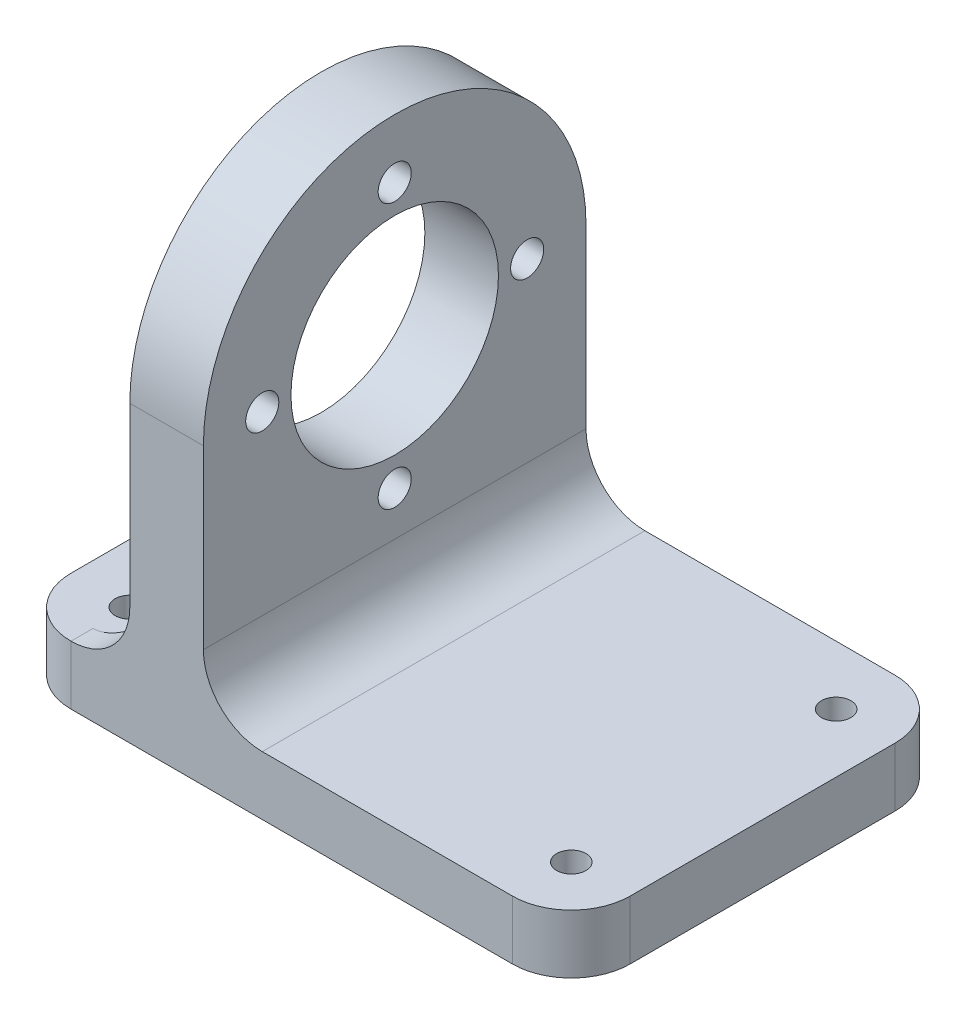
ISO-10303-21;
HEADER;
FILE_DESCRIPTION(('STEP AP214'),'2;1');
FILE_NAME('part.step','',(''),(''),'','','');
FILE_SCHEMA(('AUTOMOTIVE_DESIGN { 1 0 10303 214 1 1 1 1 }'));
ENDSEC;
DATA;
#1=APPLICATION_CONTEXT('core data for automotive mechanical design processes');
#2=APPLICATION_PROTOCOL_DEFINITION('international standard','automotive_design',2000,#1);
#3=PRODUCT_CONTEXT('',#1,'mechanical');
#4=PRODUCT('Part','Part','',(#3));
#5=PRODUCT_RELATED_PRODUCT_CATEGORY('part','',(#4));
#6=PRODUCT_DEFINITION_FORMATION('','',#4);
#7=PRODUCT_DEFINITION_CONTEXT('part definition',#1,'design');
#8=PRODUCT_DEFINITION('design','',#6,#7);
#9=PRODUCT_DEFINITION_SHAPE('','',#8);
#10=(LENGTH_UNIT() NAMED_UNIT(*) SI_UNIT(.MILLI.,.METRE.));
#11=(NAMED_UNIT(*) PLANE_ANGLE_UNIT() SI_UNIT($,.RADIAN.));
#12=(NAMED_UNIT(*) SI_UNIT($,.STERADIAN.) SOLID_ANGLE_UNIT());
#13=UNCERTAINTY_MEASURE_WITH_UNIT(LENGTH_MEASURE(1.E-05),#10,'distance_accuracy_value','');
#14=(GEOMETRIC_REPRESENTATION_CONTEXT(3) GLOBAL_UNCERTAINTY_ASSIGNED_CONTEXT((#13)) GLOBAL_UNIT_ASSIGNED_CONTEXT((#10,
#11,#12)) REPRESENTATION_CONTEXT('',''));
#15=CARTESIAN_POINT('',(0.,0.,0.));
#16=DIRECTION('',(0.,0.,1.));
#17=DIRECTION('',(1.,0.,0.));
#18=AXIS2_PLACEMENT_3D('',#15,#16,#17);
#19=CARTESIAN_POINT('',(-4.,-12.,-13.));
#20=DIRECTION('',(0.,0.,1.));
#21=DIRECTION('',(1.,0.,0.));
#22=AXIS2_PLACEMENT_3D('',#19,#20,#21);
#23=CYLINDRICAL_SURFACE('',#22,4.);
#24=CARTESIAN_POINT('',(-4.,-16.,-11.5));
#25=CARTESIAN_POINT('',(-3.9361734569931,-16.0000131502776,-11.5000119361833));
#26=CARTESIAN_POINT('',(-3.87235581288279,-15.9984726952158,-11.497556087082));
#27=CARTESIAN_POINT('',(-3.74526903397457,-15.9923839092343,-11.487801398607));
#28=CARTESIAN_POINT('',(-3.68199962691591,-15.9878371696499,-11.4805051214404));
#29=CARTESIAN_POINT('',(-3.55683188448498,-15.9758694168761,-11.4612175165463));
#30=CARTESIAN_POINT('',(-3.49492776215978,-15.9684650589789,-11.4492533904921));
#31=CARTESIAN_POINT('',(-3.37256863772368,-15.950968986269,-11.4208015985902));
#32=CARTESIAN_POINT('',(-3.31211376357474,-15.9408770350998,-11.4043135348875));
#33=CARTESIAN_POINT('',(-3.13374077976764,-15.9069394264561,-11.3484180072225));
#34=CARTESIAN_POINT('',(-3.01847966820751,-15.8793982100206,-11.3025263578387));
#35=CARTESIAN_POINT('',(-2.79760177570704,-15.8167371761393,-11.1953064389214));
#36=CARTESIAN_POINT('',(-2.69199702659997,-15.7816080825185,-11.1339592596032));
#37=CARTESIAN_POINT('',(-2.48404897192929,-15.7034004817843,-10.9922223923617));
#38=CARTESIAN_POINT('',(-2.38262678069981,-15.6599126870725,-10.9107091658296));
#39=CARTESIAN_POINT('',(-2.19401230208058,-15.5706198028046,-10.7335466004444));
#40=CARTESIAN_POINT('',(-2.10683724397456,-15.5248119939931,-10.637880408555));
#41=CARTESIAN_POINT('',(-1.93714236494158,-15.4286080433259,-10.4199314628017));
#42=CARTESIAN_POINT('',(-1.85685480981975,-15.3784314812397,-10.2957985974843));
#43=CARTESIAN_POINT('',(-1.71851967498831,-15.2866033240514,-10.032868257523));
#44=CARTESIAN_POINT('',(-1.66043421100966,-15.2449372642527,-9.89409628325965));
#45=CARTESIAN_POINT('',(-1.58133223226703,-15.18619167904,-9.64237966292876));
#46=CARTESIAN_POINT('',(-1.55460930916385,-15.1655383909642,-9.53206781731466));
#47=CARTESIAN_POINT('',(-1.51636327560803,-15.1356272695685,-9.30738965242584));
#48=CARTESIAN_POINT('',(-1.50481889734508,-15.1263534927716,-9.19302923729543));
#49=CARTESIAN_POINT('',(-1.4976216251141,-15.1205977077272,-8.96317366668971));
#50=CARTESIAN_POINT('',(-1.50201034162353,-15.1241491934911,-8.84767632672175));
#51=CARTESIAN_POINT('',(-1.52647377063054,-15.1435481309606,-8.61937920258979));
#52=CARTESIAN_POINT('',(-1.54656097395469,-15.1594053739266,-8.50658164024955));
#53=CARTESIAN_POINT('',(-1.60063776510631,-15.2006513514353,-8.28912366700722));
#54=CARTESIAN_POINT('',(-1.63429921073854,-15.2258140225403,-8.18433621941323));
#55=CARTESIAN_POINT('',(-1.71419581928313,-15.2829110091563,-7.98167863190361));
#56=CARTESIAN_POINT('',(-1.7604355607995,-15.314847789565,-7.88381102724438));
#57=CARTESIAN_POINT('',(-1.8741039355095,-15.3890977162385,-7.67832953618362));
#58=CARTESIAN_POINT('',(-1.94387732388335,-15.4322346899761,-7.5723112315226));
#59=CARTESIAN_POINT('',(-2.09824506398338,-15.5201177779494,-7.37233202460496));
#60=CARTESIAN_POINT('',(-2.18285358093815,-15.5648653973511,-7.27838279633564));
#61=CARTESIAN_POINT('',(-2.3809282201045,-15.6595850194453,-7.08942225498135));
#62=CARTESIAN_POINT('',(-2.49685215813149,-15.7092030056599,-6.99678651554119));
#63=CARTESIAN_POINT('',(-2.74567487958142,-15.8005468472038,-6.83232115158358));
#64=CARTESIAN_POINT('',(-2.87857473092663,-15.842272205613,-6.76049283695121));
#65=CARTESIAN_POINT('',(-3.0842997608176,-15.8943790052449,-6.67262161549608));
#66=CARTESIAN_POINT('',(-3.15196062618732,-15.9097039816921,-6.64710711609092));
#67=CARTESIAN_POINT('',(-3.28982535149926,-15.9370768282918,-6.60189624375363));
#68=CARTESIAN_POINT('',(-3.36002762068787,-15.9491267095831,-6.58219629963374));
#69=CARTESIAN_POINT('',(-3.5021902548837,-15.9695506958203,-6.54897921623228));
#70=CARTESIAN_POINT('',(-3.57414523099331,-15.9779348571125,-6.53544515743575));
#71=CARTESIAN_POINT('',(-3.71926715335585,-15.9907999206439,-6.51473323403823));
#72=CARTESIAN_POINT('',(-3.79243292424371,-15.9952844051941,-6.50754953578481));
#73=CARTESIAN_POINT('',(-3.88815279818234,-15.9984987953494,-6.50240259785252));
#74=CARTESIAN_POINT('',(-3.91052148712157,-15.9990618306498,-6.5015013400556));
#75=CARTESIAN_POINT('',(-3.95525897647898,-15.9998121600068,-6.50030047279548));
#76=CARTESIAN_POINT('',(-3.97762775453766,-15.9999998282321,-6.50000026420145));
#77=CARTESIAN_POINT('',(-4.00000000000001,-16.,-6.5));
#78=B_SPLINE_CURVE_WITH_KNOTS('',3,(#24,#25,#26,#27,#28,#29,#30,#31,#32,#33,#34,#35,#36,#37,#38,
#39,#40,#41,#42,#43,#44,#45,#46,#47,#48,#49,#50,#51,#52,#53,#54,#55,#56,#57,#58,#59,#60,#61,#62,
#63,#64,#65,#66,#67,#68,#69,#70,#71,#72,#73,#74,#75,#76,#77),.UNSPECIFIED.,.F.,.F.,(4,2,2,2,2,2,
2,2,2,2,2,2,2,2,2,2,2,2,2,2,2,2,2,2,2,2,4),(0.,0.191399175832532,0.382697118170854,
0.572896542435409,0.763112699040344,1.14253664794783,1.52242709447158,1.93241222665572,
2.34288954923405,2.80899997842292,3.27431147694233,3.618974902824,3.96315487815413,
4.30823435125186,4.65358867387747,4.99105200609772,5.3286383425281,5.7293005514822,
6.1303474345375,6.59747389227274,7.06462975052635,7.28610034871991,7.507434639536,
7.72815786405858,7.94867811354227,8.01585211889169,8.08295913123195),.UNSPECIFIED.);
#79=CARTESIAN_POINT('',(-4.,-16.,-11.5));
#80=VERTEX_POINT('',#79);
#81=CARTESIAN_POINT('',(-4.,-16.,-6.5));
#82=VERTEX_POINT('',#81);
#83=EDGE_CURVE('E154',#80,#82,#78,.T.);
#84=ORIENTED_EDGE('',*,*,#83,.T.);
#85=DIRECTION('',(0.,0.,-1.));
#86=VECTOR('',#85,1.);
#87=CARTESIAN_POINT('',(-4.,-16.,-13.));
#88=LINE('',#87,#86);
#89=CARTESIAN_POINT('',(-4.,-16.,6.5));
#90=VERTEX_POINT('',#89);
#91=EDGE_CURVE('E163',#90,#82,#88,.T.);
#92=ORIENTED_EDGE('',*,*,#91,.F.);
#93=CARTESIAN_POINT('',(-4.,-16.,6.5));
#94=CARTESIAN_POINT('',(-3.9361734569931,-16.0000131502776,6.49998806381667));
#95=CARTESIAN_POINT('',(-3.87235581288279,-15.9984726952158,6.50244391291799));
#96=CARTESIAN_POINT('',(-3.74526903397457,-15.9923839092343,6.512198601393));
#97=CARTESIAN_POINT('',(-3.68199962691591,-15.9878371696499,6.51949487855961));
#98=CARTESIAN_POINT('',(-3.55683188448498,-15.9758694168761,6.53878248345371));
#99=CARTESIAN_POINT('',(-3.49492776215978,-15.9684650589789,6.5507466095079));
#100=CARTESIAN_POINT('',(-3.37256863772368,-15.950968986269,6.57919840140977));
#101=CARTESIAN_POINT('',(-3.31211376357474,-15.9408770350998,6.59568646511248));
#102=CARTESIAN_POINT('',(-3.13374077976764,-15.9069394264561,6.65158199277754));
#103=CARTESIAN_POINT('',(-3.0184796682075,-15.8793982100206,6.69747364216126));
#104=CARTESIAN_POINT('',(-2.79760177570704,-15.8167371761393,6.80469356107856));
#105=CARTESIAN_POINT('',(-2.69199702659997,-15.7816080825185,6.86604074039681));
#106=CARTESIAN_POINT('',(-2.48404897192929,-15.7034004817843,7.00777760763833));
#107=CARTESIAN_POINT('',(-2.38262678069981,-15.6599126870725,7.08929083417038));
#108=CARTESIAN_POINT('',(-2.19401230208058,-15.5706198028046,7.26645339955558));
#109=CARTESIAN_POINT('',(-2.10683724397456,-15.5248119939931,7.36211959144496));
#110=CARTESIAN_POINT('',(-1.93714236494158,-15.4286080433259,7.58006853719828));
#111=CARTESIAN_POINT('',(-1.85685480981975,-15.3784314812397,7.70420140251568));
#112=CARTESIAN_POINT('',(-1.71851967498831,-15.2866033240514,7.96713174247698));
#113=CARTESIAN_POINT('',(-1.66043421100966,-15.2449372642527,8.10590371674035));
#114=CARTESIAN_POINT('',(-1.58133223226703,-15.18619167904,8.35762033707123));
#115=CARTESIAN_POINT('',(-1.55460930916385,-15.1655383909642,8.46793218268533));
#116=CARTESIAN_POINT('',(-1.51636327560803,-15.1356272695685,8.69261034757415));
#117=CARTESIAN_POINT('',(-1.50481889734508,-15.1263534927716,8.80697076270456));
#118=CARTESIAN_POINT('',(-1.4976216251141,-15.1205977077272,9.03682633331029));
#119=CARTESIAN_POINT('',(-1.50201034162353,-15.1241491934911,9.15232367327825));
#120=CARTESIAN_POINT('',(-1.52647377063054,-15.1435481309606,9.38062079741021));
#121=CARTESIAN_POINT('',(-1.54656097395469,-15.1594053739266,9.49341835975045));
#122=CARTESIAN_POINT('',(-1.60063776510631,-15.2006513514353,9.71087633299277));
#123=CARTESIAN_POINT('',(-1.63429921073853,-15.2258140225403,9.81566378058677));
#124=CARTESIAN_POINT('',(-1.71419581928313,-15.2829110091563,10.0183213680964));
#125=CARTESIAN_POINT('',(-1.7604355607995,-15.314847789565,10.1161889727556));
#126=CARTESIAN_POINT('',(-1.8741039355095,-15.3890977162385,10.3216704638164));
#127=CARTESIAN_POINT('',(-1.94387732388334,-15.4322346899761,10.4276887684774));
#128=CARTESIAN_POINT('',(-2.09824506398338,-15.5201177779494,10.627667975395));
#129=CARTESIAN_POINT('',(-2.18285358093814,-15.5648653973511,10.7216172036644));
#130=CARTESIAN_POINT('',(-2.3809282201045,-15.6595850194453,10.9105777450186));
#131=CARTESIAN_POINT('',(-2.49685215813148,-15.7092030056599,11.0032134844588));
#132=CARTESIAN_POINT('',(-2.74567487958142,-15.8005468472038,11.1676788484164));
#133=CARTESIAN_POINT('',(-2.87857473092663,-15.842272205613,11.2395071630488));
#134=CARTESIAN_POINT('',(-3.08429976081759,-15.8943790052449,11.3273783845039));
#135=CARTESIAN_POINT('',(-3.15196062618731,-15.9097039816921,11.3528928839091));
#136=CARTESIAN_POINT('',(-3.28982535149925,-15.9370768282918,11.3981037562464));
#137=CARTESIAN_POINT('',(-3.36002762068786,-15.9491267095831,11.4178037003663));
#138=CARTESIAN_POINT('',(-3.5021902548837,-15.9695506958203,11.4510207837677));
#139=CARTESIAN_POINT('',(-3.57414523099331,-15.9779348571125,11.4645548425642));
#140=CARTESIAN_POINT('',(-3.71926715335585,-15.9907999206439,11.4852667659618));
#141=CARTESIAN_POINT('',(-3.7924329242437,-15.9952844051941,11.4924504642152));
#142=CARTESIAN_POINT('',(-3.88815279818234,-15.9984987953494,11.4975974021475));
#143=CARTESIAN_POINT('',(-3.91052148712157,-15.9990618306498,11.4984986599444));
#144=CARTESIAN_POINT('',(-3.95525897647898,-15.9998121600068,11.4996995272045));
#145=CARTESIAN_POINT('',(-3.97762775453766,-15.9999998282321,11.4999997357985));
#146=CARTESIAN_POINT('',(-4.00000000000001,-16.,11.5));
#147=B_SPLINE_CURVE_WITH_KNOTS('',3,(#93,#94,#95,#96,#97,#98,#99,#100,#101,#102,#103,#104,#105,
#106,#107,#108,#109,#110,#111,#112,#113,#114,#115,#116,#117,#118,#119,#120,#121,#122,#123,#124,
#125,#126,#127,#128,#129,#130,#131,#132,#133,#134,#135,#136,#137,#138,#139,#140,#141,#142,#143,
#144,#145,#146),.UNSPECIFIED.,.F.,.F.,(4,2,2,2,2,2,2,2,2,2,2,2,2,2,2,2,2,2,2,2,2,2,2,2,2,2,4),
(0.,0.191399175832533,0.382697118170854,0.572896542435409,0.763112699040344,1.14253664794783,
1.52242709447158,1.93241222665572,2.34288954923405,2.80899997842292,3.27431147694233,
3.618974902824,3.96315487815413,4.30823435125186,4.65358867387747,4.99105200609771,
5.3286383425281,5.7293005514822,6.1303474345375,6.59747389227274,7.06462975052635,
7.2861003487199,7.50743463953599,7.72815786405857,7.94867811354227,8.01585211889169,
8.08295913123195),.UNSPECIFIED.);
#148=CARTESIAN_POINT('',(-4.,-16.,11.5));
#149=VERTEX_POINT('',#148);
#150=EDGE_CURVE('E167',#90,#149,#147,.T.);
#151=ORIENTED_EDGE('',*,*,#150,.T.);
#152=CARTESIAN_POINT('',(-4.,-16.,13.));
#153=VERTEX_POINT('',#152);
#154=EDGE_CURVE('E175',#153,#149,#88,.T.);
#155=ORIENTED_EDGE('',*,*,#154,.F.);
#156=CARTESIAN_POINT('',(-4.,-12.,13.));
#157=DIRECTION('',(0.,0.,-1.));
#158=DIRECTION('',(0.,1.,0.));
#159=AXIS2_PLACEMENT_3D('',#156,#157,#158);
#160=CIRCLE('',#159,4.);
#161=CARTESIAN_POINT('',(0.,-12.,13.));
#162=VERTEX_POINT('',#161);
#163=EDGE_CURVE('E196',#162,#153,#160,.T.);
#164=ORIENTED_EDGE('',*,*,#163,.F.);
#165=DIRECTION('',(0.,0.,-1.));
#166=VECTOR('',#165,1.);
#167=CARTESIAN_POINT('',(0.,-12.,13.));
#168=LINE('',#167,#166);
#169=CARTESIAN_POINT('',(0.,-12.,-13.));
#170=VERTEX_POINT('',#169);
#171=EDGE_CURVE('E179',#170,#162,#168,.F.);
#172=ORIENTED_EDGE('',*,*,#171,.F.);
#173=CARTESIAN_POINT('',(-4.,-12.,-13.));
#174=DIRECTION('',(0.,0.,1.));
#175=DIRECTION('',(0.,-1.,0.));
#176=AXIS2_PLACEMENT_3D('',#173,#174,#175);
#177=CIRCLE('',#176,4.);
#178=CARTESIAN_POINT('',(-4.,-16.,-13.));
#179=VERTEX_POINT('',#178);
#180=EDGE_CURVE('E193',#179,#170,#177,.T.);
#181=ORIENTED_EDGE('',*,*,#180,.F.);
#182=EDGE_CURVE('E165',#80,#179,#88,.T.);
#183=ORIENTED_EDGE('',*,*,#182,.F.);
#184=EDGE_LOOP('',(#84,#92,#151,#155,#164,#172,#181,#183));
#185=FACE_BOUND('',#184,.T.);
#186=ADVANCED_FACE('F43',(#185),#23,.F.);
#187=CARTESIAN_POINT('',(-4.,13.,9.));
#188=DIRECTION('',(0.,-1.,0.));
#189=DIRECTION('',(0.,0.,-1.));
#190=AXIS2_PLACEMENT_3D('',#187,#188,#189);
#191=CYLINDRICAL_SURFACE('',#190,1.);
#192=CARTESIAN_POINT('',(-4.,-20.,9.));
#193=DIRECTION('',(0.,1.,0.));
#194=DIRECTION('',(0.,0.,1.));
#195=AXIS2_PLACEMENT_3D('',#192,#193,#194);
#196=CIRCLE('',#195,1.);
#197=CARTESIAN_POINT('',(-4.,-20.,10.));
#198=VERTEX_POINT('',#197);
#199=EDGE_CURVE('E263',#198,#198,#196,.T.);
#200=ORIENTED_EDGE('',*,*,#199,.F.);
#201=EDGE_LOOP('',(#200));
#202=FACE_BOUND('',#201,.T.);
#203=CARTESIAN_POINT('',(-4.,-16.,9.));
#204=DIRECTION('',(0.,1.,0.));
#205=DIRECTION('',(0.,0.,1.));
#206=AXIS2_PLACEMENT_3D('',#203,#204,#205);
#207=CIRCLE('',#206,1.);
#208=CARTESIAN_POINT('',(-4.,-16.,10.));
#209=VERTEX_POINT('',#208);
#210=EDGE_CURVE('E258',#209,#209,#207,.F.);
#211=ORIENTED_EDGE('',*,*,#210,.F.);
#212=EDGE_LOOP('',(#211));
#213=FACE_BOUND('',#212,.T.);
#214=ADVANCED_FACE('F448',(#202,#213),#191,.F.);
#215=CARTESIAN_POINT('',(-4.,13.,-9.));
#216=DIRECTION('',(0.,-1.,0.));
#217=DIRECTION('',(0.,0.,-1.));
#218=AXIS2_PLACEMENT_3D('',#215,#216,#217);
#219=CYLINDRICAL_SURFACE('',#218,1.);
#220=CARTESIAN_POINT('',(-4.,-20.,-9.));
#221=DIRECTION('',(0.,1.,0.));
#222=DIRECTION('',(0.,0.,1.));
#223=AXIS2_PLACEMENT_3D('',#220,#221,#222);
#224=CIRCLE('',#223,1.);
#225=CARTESIAN_POINT('',(-4.,-20.,-8.));
#226=VERTEX_POINT('',#225);
#227=EDGE_CURVE('E504',#226,#226,#224,.T.);
#228=ORIENTED_EDGE('',*,*,#227,.F.);
#229=EDGE_LOOP('',(#228));
#230=FACE_BOUND('',#229,.T.);
#231=CARTESIAN_POINT('',(-4.,-16.,-9.));
#232=DIRECTION('',(0.,1.,0.));
#233=DIRECTION('',(0.,0.,1.));
#234=AXIS2_PLACEMENT_3D('',#231,#232,#233);
#235=CIRCLE('',#234,1.);
#236=CARTESIAN_POINT('',(-4.,-16.,-8.));
#237=VERTEX_POINT('',#236);
#238=EDGE_CURVE('E250',#237,#237,#235,.F.);
#239=ORIENTED_EDGE('',*,*,#238,.F.);
#240=EDGE_LOOP('',(#239));
#241=FACE_BOUND('',#240,.T.);
#242=ADVANCED_FACE('F453',(#230,#241),#219,.F.);
#243=CARTESIAN_POINT('',(5.,0.,0.));
#244=DIRECTION('',(-1.,0.,0.));
#245=DIRECTION('',(0.,0.,1.));
#246=AXIS2_PLACEMENT_3D('',#243,#244,#245);
#247=PLANE('',#246);
#248=DIRECTION('',(0.,-1.,0.));
#249=VECTOR('',#248,1.);
#250=CARTESIAN_POINT('',(5.,0.,13.));
#251=LINE('',#250,#249);
#252=CARTESIAN_POINT('',(5.,0.,13.));
#253=VERTEX_POINT('',#252);
#254=CARTESIAN_POINT('',(5.,-12.,13.));
#255=VERTEX_POINT('',#254);
#256=EDGE_CURVE('E332',#253,#255,#251,.T.);
#257=ORIENTED_EDGE('',*,*,#256,.T.);
#258=DIRECTION('',(0.,0.,-1.));
#259=VECTOR('',#258,1.);
#260=CARTESIAN_POINT('',(5.,-12.,0.));
#261=LINE('',#260,#259);
#262=CARTESIAN_POINT('',(5.,-12.,-13.));
#263=VERTEX_POINT('',#262);
#264=EDGE_CURVE('E364',#255,#263,#261,.T.);
#265=ORIENTED_EDGE('',*,*,#264,.T.);
#266=DIRECTION('',(0.,1.,0.));
#267=VECTOR('',#266,1.);
#268=CARTESIAN_POINT('',(5.,0.,-13.));
#269=LINE('',#268,#267);
#270=CARTESIAN_POINT('',(5.,0.,-13.));
#271=VERTEX_POINT('',#270);
#272=EDGE_CURVE('E337',#263,#271,#269,.T.);
#273=ORIENTED_EDGE('',*,*,#272,.T.);
#274=CARTESIAN_POINT('',(5.,0.,0.));
#275=DIRECTION('',(1.,0.,0.));
#276=DIRECTION('',(0.,0.,1.));
#277=AXIS2_PLACEMENT_3D('',#274,#275,#276);
#278=CIRCLE('',#277,13.);
#279=EDGE_CURVE('E328',#271,#253,#278,.T.);
#280=ORIENTED_EDGE('',*,*,#279,.T.);
#281=EDGE_LOOP('',(#257,#265,#273,#280));
#282=FACE_BOUND('',#281,.T.);
#283=CARTESIAN_POINT('',(5.,9.,0.));
#284=DIRECTION('',(1.,0.,0.));
#285=DIRECTION('',(0.,0.,-1.));
#286=AXIS2_PLACEMENT_3D('',#283,#284,#285);
#287=CIRCLE('',#286,1.125);
#288=CARTESIAN_POINT('',(5.,9.,-1.125));
#289=VERTEX_POINT('',#288);
#290=EDGE_CURVE('E320',#289,#289,#287,.T.);
#291=ORIENTED_EDGE('',*,*,#290,.F.);
#292=EDGE_LOOP('',(#291));
#293=FACE_BOUND('',#292,.T.);
#294=CARTESIAN_POINT('',(5.,0.,-9.));
#295=DIRECTION('',(1.,0.,0.));
#296=DIRECTION('',(0.,0.,-1.));
#297=AXIS2_PLACEMENT_3D('',#294,#295,#296);
#298=CIRCLE('',#297,1.125);
#299=CARTESIAN_POINT('',(5.,0.,-10.125));
#300=VERTEX_POINT('',#299);
#301=EDGE_CURVE('E312',#300,#300,#298,.T.);
#302=ORIENTED_EDGE('',*,*,#301,.F.);
#303=EDGE_LOOP('',(#302));
#304=FACE_BOUND('',#303,.T.);
#305=CARTESIAN_POINT('',(5.,-9.,0.));
#306=DIRECTION('',(1.,0.,0.));
#307=DIRECTION('',(0.,0.,-1.));
#308=AXIS2_PLACEMENT_3D('',#305,#306,#307);
#309=CIRCLE('',#308,1.125);
#310=CARTESIAN_POINT('',(5.,-9.,-1.125));
#311=VERTEX_POINT('',#310);
#312=EDGE_CURVE('E304',#311,#311,#309,.T.);
#313=ORIENTED_EDGE('',*,*,#312,.F.);
#314=EDGE_LOOP('',(#313));
#315=FACE_BOUND('',#314,.T.);
#316=CARTESIAN_POINT('',(5.,0.,9.));
#317=DIRECTION('',(1.,0.,0.));
#318=DIRECTION('',(0.,0.,-1.));
#319=AXIS2_PLACEMENT_3D('',#316,#317,#318);
#320=CIRCLE('',#319,1.125);
#321=CARTESIAN_POINT('',(5.,0.,7.875));
#322=VERTEX_POINT('',#321);
#323=EDGE_CURVE('E296',#322,#322,#320,.T.);
#324=ORIENTED_EDGE('',*,*,#323,.F.);
#325=EDGE_LOOP('',(#324));
#326=FACE_BOUND('',#325,.T.);
#327=CARTESIAN_POINT('',(5.,0.,0.));
#328=DIRECTION('',(1.,0.,0.));
#329=DIRECTION('',(0.,0.,-1.));
#330=AXIS2_PLACEMENT_3D('',#327,#328,#329);
#331=CIRCLE('',#330,7.05);
#332=CARTESIAN_POINT('',(5.,0.,-7.05));
#333=VERTEX_POINT('',#332);
#334=EDGE_CURVE('E288',#333,#333,#331,.T.);
#335=ORIENTED_EDGE('',*,*,#334,.F.);
#336=EDGE_LOOP('',(#335));
#337=FACE_BOUND('',#336,.T.);
#338=ADVANCED_FACE('F383',(#282,#293,#304,#315,#326,#337),#247,.F.);
#339=CARTESIAN_POINT('',(0.,0.,0.));
#340=DIRECTION('',(-1.,0.,0.));
#341=DIRECTION('',(0.,0.,1.));
#342=AXIS2_PLACEMENT_3D('',#339,#340,#341);
#343=PLANE('',#342);
#344=DIRECTION('',(0.,1.,0.));
#345=VECTOR('',#344,1.);
#346=CARTESIAN_POINT('',(0.,0.,-13.));
#347=LINE('',#346,#345);
#348=CARTESIAN_POINT('',(0.,0.,-13.));
#349=VERTEX_POINT('',#348);
#350=EDGE_CURVE('E333',#170,#349,#347,.T.);
#351=ORIENTED_EDGE('',*,*,#350,.F.);
#352=ORIENTED_EDGE('',*,*,#171,.T.);
#353=DIRECTION('',(0.,-1.,0.));
#354=VECTOR('',#353,1.);
#355=CARTESIAN_POINT('',(0.,0.,13.));
#356=LINE('',#355,#354);
#357=CARTESIAN_POINT('',(0.,0.,13.));
#358=VERTEX_POINT('',#357);
#359=EDGE_CURVE('E344',#358,#162,#356,.T.);
#360=ORIENTED_EDGE('',*,*,#359,.F.);
#361=CARTESIAN_POINT('',(0.,0.,0.));
#362=DIRECTION('',(1.,0.,0.));
#363=DIRECTION('',(0.,0.,1.));
#364=AXIS2_PLACEMENT_3D('',#361,#362,#363);
#365=CIRCLE('',#364,13.);
#366=EDGE_CURVE('E324',#349,#358,#365,.T.);
#367=ORIENTED_EDGE('',*,*,#366,.F.);
#368=EDGE_LOOP('',(#351,#352,#360,#367));
#369=FACE_BOUND('',#368,.T.);
#370=CARTESIAN_POINT('',(0.,0.,9.));
#371=DIRECTION('',(1.,0.,0.));
#372=DIRECTION('',(0.,0.,-1.));
#373=AXIS2_PLACEMENT_3D('',#370,#371,#372);
#374=CIRCLE('',#373,1.125);
#375=CARTESIAN_POINT('',(0.,0.,7.875));
#376=VERTEX_POINT('',#375);
#377=EDGE_CURVE('E292',#376,#376,#374,.T.);
#378=ORIENTED_EDGE('',*,*,#377,.T.);
#379=EDGE_LOOP('',(#378));
#380=FACE_BOUND('',#379,.T.);
#381=CARTESIAN_POINT('',(0.,0.,-9.));
#382=DIRECTION('',(1.,0.,0.));
#383=DIRECTION('',(0.,0.,-1.));
#384=AXIS2_PLACEMENT_3D('',#381,#382,#383);
#385=CIRCLE('',#384,1.125);
#386=CARTESIAN_POINT('',(0.,0.,-10.125));
#387=VERTEX_POINT('',#386);
#388=EDGE_CURVE('E308',#387,#387,#385,.T.);
#389=ORIENTED_EDGE('',*,*,#388,.T.);
#390=EDGE_LOOP('',(#389));
#391=FACE_BOUND('',#390,.T.);
#392=CARTESIAN_POINT('',(0.,9.,0.));
#393=DIRECTION('',(1.,0.,0.));
#394=DIRECTION('',(0.,0.,-1.));
#395=AXIS2_PLACEMENT_3D('',#392,#393,#394);
#396=CIRCLE('',#395,1.125);
#397=CARTESIAN_POINT('',(0.,9.,-1.125));
#398=VERTEX_POINT('',#397);
#399=EDGE_CURVE('E316',#398,#398,#396,.T.);
#400=ORIENTED_EDGE('',*,*,#399,.T.);
#401=EDGE_LOOP('',(#400));
#402=FACE_BOUND('',#401,.T.);
#403=CARTESIAN_POINT('',(0.,-9.,0.));
#404=DIRECTION('',(1.,0.,0.));
#405=DIRECTION('',(0.,0.,-1.));
#406=AXIS2_PLACEMENT_3D('',#403,#404,#405);
#407=CIRCLE('',#406,1.125);
#408=CARTESIAN_POINT('',(0.,-9.,-1.125));
#409=VERTEX_POINT('',#408);
#410=EDGE_CURVE('E300',#409,#409,#407,.T.);
#411=ORIENTED_EDGE('',*,*,#410,.T.);
#412=EDGE_LOOP('',(#411));
#413=FACE_BOUND('',#412,.T.);
#414=CARTESIAN_POINT('',(0.,0.,0.));
#415=DIRECTION('',(1.,0.,0.));
#416=DIRECTION('',(0.,0.,-1.));
#417=AXIS2_PLACEMENT_3D('',#414,#415,#416);
#418=CIRCLE('',#417,7.05);
#419=CARTESIAN_POINT('',(0.,0.,-7.05));
#420=VERTEX_POINT('',#419);
#421=EDGE_CURVE('E285',#420,#420,#418,.T.);
#422=ORIENTED_EDGE('',*,*,#421,.T.);
#423=EDGE_LOOP('',(#422));
#424=FACE_BOUND('',#423,.T.);
#425=ADVANCED_FACE('F417',(#369,#380,#391,#402,#413,#424),#343,.T.);
#426=CARTESIAN_POINT('',(5.,0.,0.));
#427=DIRECTION('',(-1.,0.,0.));
#428=DIRECTION('',(0.,0.,1.));
#429=AXIS2_PLACEMENT_3D('',#426,#427,#428);
#430=CYLINDRICAL_SURFACE('',#429,13.);
#431=ORIENTED_EDGE('',*,*,#366,.T.);
#432=DIRECTION('',(-1.,0.,0.));
#433=VECTOR('',#432,1.);
#434=CARTESIAN_POINT('',(5.,0.,13.));
#435=LINE('',#434,#433);
#436=EDGE_CURVE('E361',#253,#358,#435,.T.);
#437=ORIENTED_EDGE('',*,*,#436,.F.);
#438=ORIENTED_EDGE('',*,*,#279,.F.);
#439=DIRECTION('',(-1.,0.,0.));
#440=VECTOR('',#439,1.);
#441=CARTESIAN_POINT('',(5.,0.,-13.));
#442=LINE('',#441,#440);
#443=EDGE_CURVE('E340',#271,#349,#442,.T.);
#444=ORIENTED_EDGE('',*,*,#443,.T.);
#445=EDGE_LOOP('',(#431,#437,#438,#444));
#446=FACE_BOUND('',#445,.T.);
#447=ADVANCED_FACE('F389',(#446),#430,.T.);
#448=CARTESIAN_POINT('',(5.,0.,13.));
#449=DIRECTION('',(0.,0.,-1.));
#450=DIRECTION('',(0.,1.,0.));
#451=AXIS2_PLACEMENT_3D('',#448,#449,#450);
#452=PLANE('',#451);
#453=DIRECTION('',(-1.,0.,0.));
#454=VECTOR('',#453,1.);
#455=CARTESIAN_POINT('',(5.,-20.,13.));
#456=LINE('',#455,#454);
#457=CARTESIAN_POINT('',(26.,-20.,13.));
#458=VERTEX_POINT('',#457);
#459=CARTESIAN_POINT('',(-4.,-20.,13.));
#460=VERTEX_POINT('',#459);
#461=EDGE_CURVE('E357',#458,#460,#456,.T.);
#462=ORIENTED_EDGE('',*,*,#461,.F.);
#463=DIRECTION('',(0.,1.,0.));
#464=VECTOR('',#463,1.);
#465=CARTESIAN_POINT('',(26.,-16.,13.));
#466=LINE('',#465,#464);
#467=CARTESIAN_POINT('',(26.,-16.,13.));
#468=VERTEX_POINT('',#467);
#469=EDGE_CURVE('E235',#458,#468,#466,.T.);
#470=ORIENTED_EDGE('',*,*,#469,.T.);
#471=DIRECTION('',(-1.,0.,0.));
#472=VECTOR('',#471,1.);
#473=CARTESIAN_POINT('',(30.,-16.,13.));
#474=LINE('',#473,#472);
#475=CARTESIAN_POINT('',(9.,-16.,13.));
#476=VERTEX_POINT('',#475);
#477=EDGE_CURVE('E281',#468,#476,#474,.T.);
#478=ORIENTED_EDGE('',*,*,#477,.T.);
#479=CARTESIAN_POINT('',(9.,-12.,13.));
#480=DIRECTION('',(0.,0.,-1.));
#481=DIRECTION('',(0.,1.,0.));
#482=AXIS2_PLACEMENT_3D('',#479,#480,#481);
#483=CIRCLE('',#482,4.);
#484=EDGE_CURVE('E190',#476,#255,#483,.T.);
#485=ORIENTED_EDGE('',*,*,#484,.T.);
#486=ORIENTED_EDGE('',*,*,#256,.F.);
#487=ORIENTED_EDGE('',*,*,#436,.T.);
#488=ORIENTED_EDGE('',*,*,#359,.T.);
#489=ORIENTED_EDGE('',*,*,#163,.T.);
#490=DIRECTION('',(0.,1.,0.));
#491=VECTOR('',#490,1.);
#492=CARTESIAN_POINT('',(-4.,0.,13.));
#493=LINE('',#492,#491);
#494=EDGE_CURVE('E232',#153,#460,#493,.F.);
#495=ORIENTED_EDGE('',*,*,#494,.T.);
#496=EDGE_LOOP('',(#462,#470,#478,#485,#486,#487,#488,#489,#495));
#497=FACE_BOUND('',#496,.T.);
#498=ADVANCED_FACE('F382',(#497),#452,.F.);
#499=CARTESIAN_POINT('',(5.,-20.,13.));
#500=DIRECTION('',(0.,1.,0.));
#501=DIRECTION('',(0.,0.,1.));
#502=AXIS2_PLACEMENT_3D('',#499,#500,#501);
#503=PLANE('',#502);
#504=CARTESIAN_POINT('',(26.,-20.,9.));
#505=DIRECTION('',(0.,1.,0.));
#506=DIRECTION('',(0.,0.,1.));
#507=AXIS2_PLACEMENT_3D('',#504,#505,#506);
#508=CIRCLE('',#507,1.);
#509=CARTESIAN_POINT('',(26.,-20.,10.));
#510=VERTEX_POINT('',#509);
#511=EDGE_CURVE('E158',#510,#510,#508,.T.);
#512=ORIENTED_EDGE('',*,*,#511,.T.);
#513=EDGE_LOOP('',(#512));
#514=FACE_BOUND('',#513,.T.);
#515=CARTESIAN_POINT('',(26.,-20.,-9.));
#516=DIRECTION('',(0.,1.,0.));
#517=DIRECTION('',(0.,0.,1.));
#518=AXIS2_PLACEMENT_3D('',#515,#516,#517);
#519=CIRCLE('',#518,1.);
#520=CARTESIAN_POINT('',(26.,-20.,-8.));
#521=VERTEX_POINT('',#520);
#522=EDGE_CURVE('E500',#521,#521,#519,.T.);
#523=ORIENTED_EDGE('',*,*,#522,.T.);
#524=EDGE_LOOP('',(#523));
#525=FACE_BOUND('',#524,.T.);
#526=ORIENTED_EDGE('',*,*,#227,.T.);
#527=EDGE_LOOP('',(#526));
#528=FACE_BOUND('',#527,.T.);
#529=ORIENTED_EDGE('',*,*,#199,.T.);
#530=EDGE_LOOP('',(#529));
#531=FACE_BOUND('',#530,.T.);
#532=DIRECTION('',(-1.,0.,0.));
#533=VECTOR('',#532,1.);
#534=CARTESIAN_POINT('',(5.,-20.,-13.));
#535=LINE('',#534,#533);
#536=CARTESIAN_POINT('',(26.,-20.,-13.));
#537=VERTEX_POINT('',#536);
#538=CARTESIAN_POINT('',(-4.,-20.,-13.));
#539=VERTEX_POINT('',#538);
#540=EDGE_CURVE('E353',#537,#539,#535,.T.);
#541=ORIENTED_EDGE('',*,*,#540,.F.);
#542=CARTESIAN_POINT('',(26.,-20.,-9.));
#543=DIRECTION('',(0.,1.,0.));
#544=DIRECTION('',(0.,0.,1.));
#545=AXIS2_PLACEMENT_3D('',#542,#543,#544);
#546=CIRCLE('',#545,4.);
#547=CARTESIAN_POINT('',(30.,-20.,-9.));
#548=VERTEX_POINT('',#547);
#549=EDGE_CURVE('E217',#537,#548,#546,.F.);
#550=ORIENTED_EDGE('',*,*,#549,.T.);
#551=DIRECTION('',(0.,0.,1.));
#552=VECTOR('',#551,1.);
#553=CARTESIAN_POINT('',(30.,-20.,-13.));
#554=LINE('',#553,#552);
#555=CARTESIAN_POINT('',(30.,-20.,9.));
#556=VERTEX_POINT('',#555);
#557=EDGE_CURVE('E273',#548,#556,#554,.T.);
#558=ORIENTED_EDGE('',*,*,#557,.T.);
#559=CARTESIAN_POINT('',(26.,-20.,9.));
#560=DIRECTION('',(0.,1.,0.));
#561=DIRECTION('',(0.,0.,1.));
#562=AXIS2_PLACEMENT_3D('',#559,#560,#561);
#563=CIRCLE('',#562,4.);
#564=EDGE_CURVE('E214',#556,#458,#563,.F.);
#565=ORIENTED_EDGE('',*,*,#564,.T.);
#566=ORIENTED_EDGE('',*,*,#461,.T.);
#567=CARTESIAN_POINT('',(-4.,-20.,9.));
#568=DIRECTION('',(0.,1.,0.));
#569=DIRECTION('',(0.,0.,1.));
#570=AXIS2_PLACEMENT_3D('',#567,#568,#569);
#571=CIRCLE('',#570,4.);
#572=CARTESIAN_POINT('',(-8.,-20.,9.));
#573=VERTEX_POINT('',#572);
#574=EDGE_CURVE('E208',#460,#573,#571,.F.);
#575=ORIENTED_EDGE('',*,*,#574,.T.);
#576=DIRECTION('',(0.,0.,1.));
#577=VECTOR('',#576,1.);
#578=CARTESIAN_POINT('',(-8.,-20.,-13.));
#579=LINE('',#578,#577);
#580=CARTESIAN_POINT('',(-8.,-20.,-9.));
#581=VERTEX_POINT('',#580);
#582=EDGE_CURVE('E256',#581,#573,#579,.T.);
#583=ORIENTED_EDGE('',*,*,#582,.F.);
#584=CARTESIAN_POINT('',(-4.,-20.,-9.));
#585=DIRECTION('',(0.,1.,0.));
#586=DIRECTION('',(0.,0.,1.));
#587=AXIS2_PLACEMENT_3D('',#584,#585,#586);
#588=CIRCLE('',#587,4.);
#589=EDGE_CURVE('E211',#581,#539,#588,.F.);
#590=ORIENTED_EDGE('',*,*,#589,.T.);
#591=EDGE_LOOP('',(#541,#550,#558,#565,#566,#575,#583,#590));
#592=FACE_BOUND('',#591,.T.);
#593=ADVANCED_FACE('F399',(#514,#525,#528,#531,#592),#503,.F.);
#594=CARTESIAN_POINT('',(5.,0.,-13.));
#595=DIRECTION('',(0.,0.,1.));
#596=DIRECTION('',(0.,-1.,0.));
#597=AXIS2_PLACEMENT_3D('',#594,#595,#596);
#598=PLANE('',#597);
#599=DIRECTION('',(-1.,0.,0.));
#600=VECTOR('',#599,1.);
#601=CARTESIAN_POINT('',(30.,-16.,-13.));
#602=LINE('',#601,#600);
#603=CARTESIAN_POINT('',(26.,-16.,-13.));
#604=VERTEX_POINT('',#603);
#605=CARTESIAN_POINT('',(9.,-16.,-13.));
#606=VERTEX_POINT('',#605);
#607=EDGE_CURVE('E282',#604,#606,#602,.T.);
#608=ORIENTED_EDGE('',*,*,#607,.F.);
#609=DIRECTION('',(0.,-1.,0.));
#610=VECTOR('',#609,1.);
#611=CARTESIAN_POINT('',(26.,-20.,-13.));
#612=LINE('',#611,#610);
#613=EDGE_CURVE('E204',#604,#537,#612,.T.);
#614=ORIENTED_EDGE('',*,*,#613,.T.);
#615=ORIENTED_EDGE('',*,*,#540,.T.);
#616=DIRECTION('',(0.,-1.,0.));
#617=VECTOR('',#616,1.);
#618=CARTESIAN_POINT('',(-4.,0.,-13.));
#619=LINE('',#618,#617);
#620=EDGE_CURVE('E200',#539,#179,#619,.F.);
#621=ORIENTED_EDGE('',*,*,#620,.T.);
#622=ORIENTED_EDGE('',*,*,#180,.T.);
#623=ORIENTED_EDGE('',*,*,#350,.T.);
#624=ORIENTED_EDGE('',*,*,#443,.F.);
#625=ORIENTED_EDGE('',*,*,#272,.F.);
#626=CARTESIAN_POINT('',(9.,-12.,-13.));
#627=DIRECTION('',(0.,0.,1.));
#628=DIRECTION('',(0.,-1.,0.));
#629=AXIS2_PLACEMENT_3D('',#626,#627,#628);
#630=CIRCLE('',#629,4.);
#631=EDGE_CURVE('E186',#263,#606,#630,.T.);
#632=ORIENTED_EDGE('',*,*,#631,.T.);
#633=EDGE_LOOP('',(#608,#614,#615,#621,#622,#623,#624,#625,#632));
#634=FACE_BOUND('',#633,.T.);
#635=ADVANCED_FACE('F415',(#634),#598,.F.);
#636=CARTESIAN_POINT('',(5.,9.,0.));
#637=DIRECTION('',(-1.,0.,0.));
#638=DIRECTION('',(0.,0.,1.));
#639=AXIS2_PLACEMENT_3D('',#636,#637,#638);
#640=CYLINDRICAL_SURFACE('',#639,1.125);
#641=ORIENTED_EDGE('',*,*,#290,.T.);
#642=EDGE_LOOP('',(#641));
#643=FACE_BOUND('',#642,.T.);
#644=ORIENTED_EDGE('',*,*,#399,.F.);
#645=EDGE_LOOP('',(#644));
#646=FACE_BOUND('',#645,.T.);
#647=ADVANCED_FACE('F664',(#643,#646),#640,.F.);
#648=CARTESIAN_POINT('',(5.,0.,-9.));
#649=DIRECTION('',(-1.,0.,0.));
#650=DIRECTION('',(0.,0.,1.));
#651=AXIS2_PLACEMENT_3D('',#648,#649,#650);
#652=CYLINDRICAL_SURFACE('',#651,1.125);
#653=ORIENTED_EDGE('',*,*,#301,.T.);
#654=EDGE_LOOP('',(#653));
#655=FACE_BOUND('',#654,.T.);
#656=ORIENTED_EDGE('',*,*,#388,.F.);
#657=EDGE_LOOP('',(#656));
#658=FACE_BOUND('',#657,.T.);
#659=ADVANCED_FACE('F670',(#655,#658),#652,.F.);
#660=CARTESIAN_POINT('',(5.,-9.,0.));
#661=DIRECTION('',(-1.,0.,0.));
#662=DIRECTION('',(0.,0.,1.));
#663=AXIS2_PLACEMENT_3D('',#660,#661,#662);
#664=CYLINDRICAL_SURFACE('',#663,1.125);
#665=ORIENTED_EDGE('',*,*,#312,.T.);
#666=EDGE_LOOP('',(#665));
#667=FACE_BOUND('',#666,.T.);
#668=ORIENTED_EDGE('',*,*,#410,.F.);
#669=EDGE_LOOP('',(#668));
#670=FACE_BOUND('',#669,.T.);
#671=ADVANCED_FACE('F443',(#667,#670),#664,.F.);
#672=CARTESIAN_POINT('',(5.,0.,9.));
#673=DIRECTION('',(-1.,0.,0.));
#674=DIRECTION('',(0.,0.,1.));
#675=AXIS2_PLACEMENT_3D('',#672,#673,#674);
#676=CYLINDRICAL_SURFACE('',#675,1.125);
#677=ORIENTED_EDGE('',*,*,#323,.T.);
#678=EDGE_LOOP('',(#677));
#679=FACE_BOUND('',#678,.T.);
#680=ORIENTED_EDGE('',*,*,#377,.F.);
#681=EDGE_LOOP('',(#680));
#682=FACE_BOUND('',#681,.T.);
#683=ADVANCED_FACE('F434',(#679,#682),#676,.F.);
#684=CARTESIAN_POINT('',(5.,0.,0.));
#685=DIRECTION('',(-1.,0.,0.));
#686=DIRECTION('',(0.,0.,1.));
#687=AXIS2_PLACEMENT_3D('',#684,#685,#686);
#688=CYLINDRICAL_SURFACE('',#687,7.05);
#689=ORIENTED_EDGE('',*,*,#334,.T.);
#690=EDGE_LOOP('',(#689));
#691=FACE_BOUND('',#690,.T.);
#692=ORIENTED_EDGE('',*,*,#421,.F.);
#693=EDGE_LOOP('',(#692));
#694=FACE_BOUND('',#693,.T.);
#695=ADVANCED_FACE('F431',(#691,#694),#688,.F.);
#696=CARTESIAN_POINT('',(-8.,0.,0.));
#697=DIRECTION('',(1.,0.,0.));
#698=DIRECTION('',(0.,0.,-1.));
#699=AXIS2_PLACEMENT_3D('',#696,#697,#698);
#700=PLANE('',#699);
#701=DIRECTION('',(0.,0.,-1.));
#702=VECTOR('',#701,1.);
#703=CARTESIAN_POINT('',(-8.,-16.,-13.));
#704=LINE('',#703,#702);
#705=CARTESIAN_POINT('',(-8.,-16.,9.));
#706=VERTEX_POINT('',#705);
#707=CARTESIAN_POINT('',(-8.,-16.,-9.));
#708=VERTEX_POINT('',#707);
#709=EDGE_CURVE('E270',#706,#708,#704,.T.);
#710=ORIENTED_EDGE('',*,*,#709,.T.);
#711=DIRECTION('',(0.,-1.,0.));
#712=VECTOR('',#711,1.);
#713=CARTESIAN_POINT('',(-8.,0.,-9.));
#714=LINE('',#713,#712);
#715=EDGE_CURVE('E242',#708,#581,#714,.T.);
#716=ORIENTED_EDGE('',*,*,#715,.T.);
#717=ORIENTED_EDGE('',*,*,#582,.T.);
#718=DIRECTION('',(0.,1.,0.));
#719=VECTOR('',#718,1.);
#720=CARTESIAN_POINT('',(-8.,0.,9.));
#721=LINE('',#720,#719);
#722=EDGE_CURVE('E239',#573,#706,#721,.T.);
#723=ORIENTED_EDGE('',*,*,#722,.T.);
#724=EDGE_LOOP('',(#710,#716,#717,#723));
#725=FACE_BOUND('',#724,.T.);
#726=ADVANCED_FACE('F433',(#725),#700,.F.);
#727=CARTESIAN_POINT('',(30.,-16.,-13.));
#728=DIRECTION('',(0.,1.,0.));
#729=DIRECTION('',(0.,0.,1.));
#730=AXIS2_PLACEMENT_3D('',#727,#728,#729);
#731=PLANE('',#730);
#732=CARTESIAN_POINT('',(-4.,-16.,-9.));
#733=DIRECTION('',(0.,1.,0.));
#734=DIRECTION('',(0.,0.,1.));
#735=AXIS2_PLACEMENT_3D('',#732,#733,#734);
#736=CIRCLE('',#735,2.5);
#737=EDGE_CURVE('E151',#82,#80,#736,.T.);
#738=ORIENTED_EDGE('',*,*,#737,.T.);
#739=ORIENTED_EDGE('',*,*,#182,.T.);
#740=CARTESIAN_POINT('',(-4.,-16.,-9.));
#741=DIRECTION('',(0.,1.,0.));
#742=DIRECTION('',(0.,0.,1.));
#743=AXIS2_PLACEMENT_3D('',#740,#741,#742);
#744=CIRCLE('',#743,4.);
#745=EDGE_CURVE('E11',#179,#708,#744,.T.);
#746=ORIENTED_EDGE('',*,*,#745,.T.);
#747=ORIENTED_EDGE('',*,*,#709,.F.);
#748=CARTESIAN_POINT('',(-4.,-16.,9.));
#749=DIRECTION('',(0.,1.,0.));
#750=DIRECTION('',(0.,0.,1.));
#751=AXIS2_PLACEMENT_3D('',#748,#749,#750);
#752=CIRCLE('',#751,4.);
#753=EDGE_CURVE('E53',#706,#153,#752,.T.);
#754=ORIENTED_EDGE('',*,*,#753,.T.);
#755=ORIENTED_EDGE('',*,*,#154,.T.);
#756=CARTESIAN_POINT('',(-4.,-16.,9.));
#757=DIRECTION('',(0.,1.,0.));
#758=DIRECTION('',(0.,0.,1.));
#759=AXIS2_PLACEMENT_3D('',#756,#757,#758);
#760=CIRCLE('',#759,2.5);
#761=EDGE_CURVE('E172',#149,#90,#760,.T.);
#762=ORIENTED_EDGE('',*,*,#761,.T.);
#763=ORIENTED_EDGE('',*,*,#91,.T.);
#764=EDGE_LOOP('',(#738,#739,#746,#747,#754,#755,#762,#763));
#765=FACE_BOUND('',#764,.T.);
#766=ORIENTED_EDGE('',*,*,#238,.T.);
#767=EDGE_LOOP('',(#766));
#768=FACE_BOUND('',#767,.T.);
#769=ORIENTED_EDGE('',*,*,#210,.T.);
#770=EDGE_LOOP('',(#769));
#771=FACE_BOUND('',#770,.T.);
#772=ADVANCED_FACE('F169',(#765,#768,#771),#731,.T.);
#773=CARTESIAN_POINT('',(26.,-16.,9.));
#774=DIRECTION('',(0.,1.,0.));
#775=DIRECTION('',(0.,0.,1.));
#776=AXIS2_PLACEMENT_3D('',#773,#774,#775);
#777=CIRCLE('',#776,1.);
#778=CARTESIAN_POINT('',(26.,-16.,10.));
#779=VERTEX_POINT('',#778);
#780=EDGE_CURVE('E47',#779,#779,#777,.F.);
#781=ORIENTED_EDGE('',*,*,#780,.T.);
#782=EDGE_LOOP('',(#781));
#783=FACE_BOUND('',#782,.T.);
#784=CARTESIAN_POINT('',(26.,-16.,-9.));
#785=DIRECTION('',(0.,1.,0.));
#786=DIRECTION('',(0.,0.,1.));
#787=AXIS2_PLACEMENT_3D('',#784,#785,#786);
#788=CIRCLE('',#787,1.);
#789=CARTESIAN_POINT('',(26.,-16.,-8.));
#790=VERTEX_POINT('',#789);
#791=EDGE_CURVE('E247',#790,#790,#788,.F.);
#792=ORIENTED_EDGE('',*,*,#791,.T.);
#793=EDGE_LOOP('',(#792));
#794=FACE_BOUND('',#793,.T.);
#795=DIRECTION('',(0.,0.,-1.));
#796=VECTOR('',#795,1.);
#797=CARTESIAN_POINT('',(30.,-16.,-13.));
#798=LINE('',#797,#796);
#799=CARTESIAN_POINT('',(30.,-16.,9.));
#800=VERTEX_POINT('',#799);
#801=CARTESIAN_POINT('',(30.,-16.,-9.));
#802=VERTEX_POINT('',#801);
#803=EDGE_CURVE('E277',#800,#802,#798,.T.);
#804=ORIENTED_EDGE('',*,*,#803,.T.);
#805=CARTESIAN_POINT('',(26.,-16.,-9.));
#806=DIRECTION('',(0.,1.,0.));
#807=DIRECTION('',(0.,0.,1.));
#808=AXIS2_PLACEMENT_3D('',#805,#806,#807);
#809=CIRCLE('',#808,4.);
#810=EDGE_CURVE('E229',#802,#604,#809,.T.);
#811=ORIENTED_EDGE('',*,*,#810,.T.);
#812=ORIENTED_EDGE('',*,*,#607,.T.);
#813=DIRECTION('',(0.,0.,-1.));
#814=VECTOR('',#813,1.);
#815=CARTESIAN_POINT('',(9.,-16.,-13.));
#816=LINE('',#815,#814);
#817=EDGE_CURVE('E180',#606,#476,#816,.F.);
#818=ORIENTED_EDGE('',*,*,#817,.T.);
#819=ORIENTED_EDGE('',*,*,#477,.F.);
#820=CARTESIAN_POINT('',(26.,-16.,9.));
#821=DIRECTION('',(0.,1.,0.));
#822=DIRECTION('',(0.,0.,1.));
#823=AXIS2_PLACEMENT_3D('',#820,#821,#822);
#824=CIRCLE('',#823,4.);
#825=EDGE_CURVE('E226',#468,#800,#824,.T.);
#826=ORIENTED_EDGE('',*,*,#825,.T.);
#827=EDGE_LOOP('',(#804,#811,#812,#818,#819,#826));
#828=FACE_BOUND('',#827,.T.);
#829=ADVANCED_FACE('F376',(#783,#794,#828),#731,.T.);
#830=CARTESIAN_POINT('',(30.,0.,0.));
#831=DIRECTION('',(1.,0.,0.));
#832=DIRECTION('',(0.,0.,-1.));
#833=AXIS2_PLACEMENT_3D('',#830,#831,#832);
#834=PLANE('',#833);
#835=ORIENTED_EDGE('',*,*,#557,.F.);
#836=DIRECTION('',(0.,-1.,0.));
#837=VECTOR('',#836,1.);
#838=CARTESIAN_POINT('',(30.,-16.,-9.));
#839=LINE('',#838,#837);
#840=EDGE_CURVE('E223',#548,#802,#839,.F.);
#841=ORIENTED_EDGE('',*,*,#840,.T.);
#842=ORIENTED_EDGE('',*,*,#803,.F.);
#843=DIRECTION('',(0.,1.,0.));
#844=VECTOR('',#843,1.);
#845=CARTESIAN_POINT('',(30.,-20.,9.));
#846=LINE('',#845,#844);
#847=EDGE_CURVE('E220',#800,#556,#846,.F.);
#848=ORIENTED_EDGE('',*,*,#847,.T.);
#849=EDGE_LOOP('',(#835,#841,#842,#848));
#850=FACE_BOUND('',#849,.T.);
#851=ADVANCED_FACE('F409',(#850),#834,.T.);
#852=CARTESIAN_POINT('',(9.,-12.,0.));
#853=DIRECTION('',(0.,0.,-1.));
#854=DIRECTION('',(-1.,0.,0.));
#855=AXIS2_PLACEMENT_3D('',#852,#853,#854);
#856=CYLINDRICAL_SURFACE('',#855,4.);
#857=ORIENTED_EDGE('',*,*,#484,.F.);
#858=ORIENTED_EDGE('',*,*,#817,.F.);
#859=ORIENTED_EDGE('',*,*,#631,.F.);
#860=ORIENTED_EDGE('',*,*,#264,.F.);
#861=EDGE_LOOP('',(#857,#858,#859,#860));
#862=FACE_BOUND('',#861,.T.);
#863=ADVANCED_FACE('F379',(#862),#856,.F.);
#864=CARTESIAN_POINT('',(26.,0.,-9.));
#865=DIRECTION('',(0.,1.,0.));
#866=DIRECTION('',(0.,0.,1.));
#867=AXIS2_PLACEMENT_3D('',#864,#865,#866);
#868=CYLINDRICAL_SURFACE('',#867,4.);
#869=ORIENTED_EDGE('',*,*,#810,.F.);
#870=ORIENTED_EDGE('',*,*,#840,.F.);
#871=ORIENTED_EDGE('',*,*,#549,.F.);
#872=ORIENTED_EDGE('',*,*,#613,.F.);
#873=EDGE_LOOP('',(#869,#870,#871,#872));
#874=FACE_BOUND('',#873,.T.);
#875=ADVANCED_FACE('F412',(#874),#868,.T.);
#876=CARTESIAN_POINT('',(26.,0.,9.));
#877=DIRECTION('',(0.,-1.,0.));
#878=DIRECTION('',(0.,0.,-1.));
#879=AXIS2_PLACEMENT_3D('',#876,#877,#878);
#880=CYLINDRICAL_SURFACE('',#879,4.);
#881=ORIENTED_EDGE('',*,*,#564,.F.);
#882=ORIENTED_EDGE('',*,*,#847,.F.);
#883=ORIENTED_EDGE('',*,*,#825,.F.);
#884=ORIENTED_EDGE('',*,*,#469,.F.);
#885=EDGE_LOOP('',(#881,#882,#883,#884));
#886=FACE_BOUND('',#885,.T.);
#887=ADVANCED_FACE('F405',(#886),#880,.T.);
#888=CARTESIAN_POINT('',(-4.,0.,-9.));
#889=DIRECTION('',(0.,-1.,0.));
#890=DIRECTION('',(0.,0.,-1.));
#891=AXIS2_PLACEMENT_3D('',#888,#889,#890);
#892=CYLINDRICAL_SURFACE('',#891,4.);
#893=ORIENTED_EDGE('',*,*,#745,.F.);
#894=ORIENTED_EDGE('',*,*,#620,.F.);
#895=ORIENTED_EDGE('',*,*,#589,.F.);
#896=ORIENTED_EDGE('',*,*,#715,.F.);
#897=EDGE_LOOP('',(#893,#894,#895,#896));
#898=FACE_BOUND('',#897,.T.);
#899=ADVANCED_FACE('F462',(#898),#892,.T.);
#900=CARTESIAN_POINT('',(-4.,0.,9.));
#901=DIRECTION('',(0.,1.,0.));
#902=DIRECTION('',(0.,0.,1.));
#903=AXIS2_PLACEMENT_3D('',#900,#901,#902);
#904=CYLINDRICAL_SURFACE('',#903,4.);
#905=ORIENTED_EDGE('',*,*,#574,.F.);
#906=ORIENTED_EDGE('',*,*,#494,.F.);
#907=ORIENTED_EDGE('',*,*,#753,.F.);
#908=ORIENTED_EDGE('',*,*,#722,.F.);
#909=EDGE_LOOP('',(#905,#906,#907,#908));
#910=FACE_BOUND('',#909,.T.);
#911=ADVANCED_FACE('F45',(#910),#904,.T.);
#912=CARTESIAN_POINT('',(26.,13.,-9.));
#913=DIRECTION('',(0.,-1.,0.));
#914=DIRECTION('',(0.,0.,-1.));
#915=AXIS2_PLACEMENT_3D('',#912,#913,#914);
#916=CYLINDRICAL_SURFACE('',#915,1.);
#917=ORIENTED_EDGE('',*,*,#791,.F.);
#918=EDGE_LOOP('',(#917));
#919=FACE_BOUND('',#918,.T.);
#920=ORIENTED_EDGE('',*,*,#522,.F.);
#921=EDGE_LOOP('',(#920));
#922=FACE_BOUND('',#921,.T.);
#923=ADVANCED_FACE('F468',(#919,#922),#916,.F.);
#924=CARTESIAN_POINT('',(26.,13.,9.));
#925=DIRECTION('',(0.,-1.,0.));
#926=DIRECTION('',(0.,0.,-1.));
#927=AXIS2_PLACEMENT_3D('',#924,#925,#926);
#928=CYLINDRICAL_SURFACE('',#927,1.);
#929=ORIENTED_EDGE('',*,*,#780,.F.);
#930=EDGE_LOOP('',(#929));
#931=FACE_BOUND('',#930,.T.);
#932=ORIENTED_EDGE('',*,*,#511,.F.);
#933=EDGE_LOOP('',(#932));
#934=FACE_BOUND('',#933,.T.);
#935=ADVANCED_FACE('F474',(#931,#934),#928,.F.);
#936=CARTESIAN_POINT('',(-4.,13.001,-9.));
#937=DIRECTION('',(0.,-1.,0.));
#938=DIRECTION('',(0.,0.,-1.));
#939=AXIS2_PLACEMENT_3D('',#936,#937,#938);
#940=CYLINDRICAL_SURFACE('',#939,2.5);
#941=ORIENTED_EDGE('',*,*,#737,.F.);
#942=ORIENTED_EDGE('',*,*,#83,.F.);
#943=EDGE_LOOP('',(#941,#942));
#944=FACE_BOUND('',#943,.T.);
#945=ADVANCED_FACE('F153',(#944),#940,.F.);
#946=CARTESIAN_POINT('',(-4.,13.001,9.));
#947=DIRECTION('',(0.,-1.,0.));
#948=DIRECTION('',(0.,0.,-1.));
#949=AXIS2_PLACEMENT_3D('',#946,#947,#948);
#950=CYLINDRICAL_SURFACE('',#949,2.5);
#951=ORIENTED_EDGE('',*,*,#761,.F.);
#952=ORIENTED_EDGE('',*,*,#150,.F.);
#953=EDGE_LOOP('',(#951,#952));
#954=FACE_BOUND('',#953,.T.);
#955=ADVANCED_FACE('F523',(#954),#950,.F.);
#956=CLOSED_SHELL('',(#186,#214,#242,#338,#425,#447,#498,#593,#635,#647,#659,#671,#683,#695,
#726,#772,#829,#851,#863,#875,#887,#899,#911,#923,#935,#945,#955));
#957=MANIFOLD_SOLID_BREP('B2',#956);
#958=ADVANCED_BREP_SHAPE_REPRESENTATION('',(#18,#957),#14);
#959=SHAPE_DEFINITION_REPRESENTATION(#9,#958);
ENDSEC;
END-ISO-10303-21;
